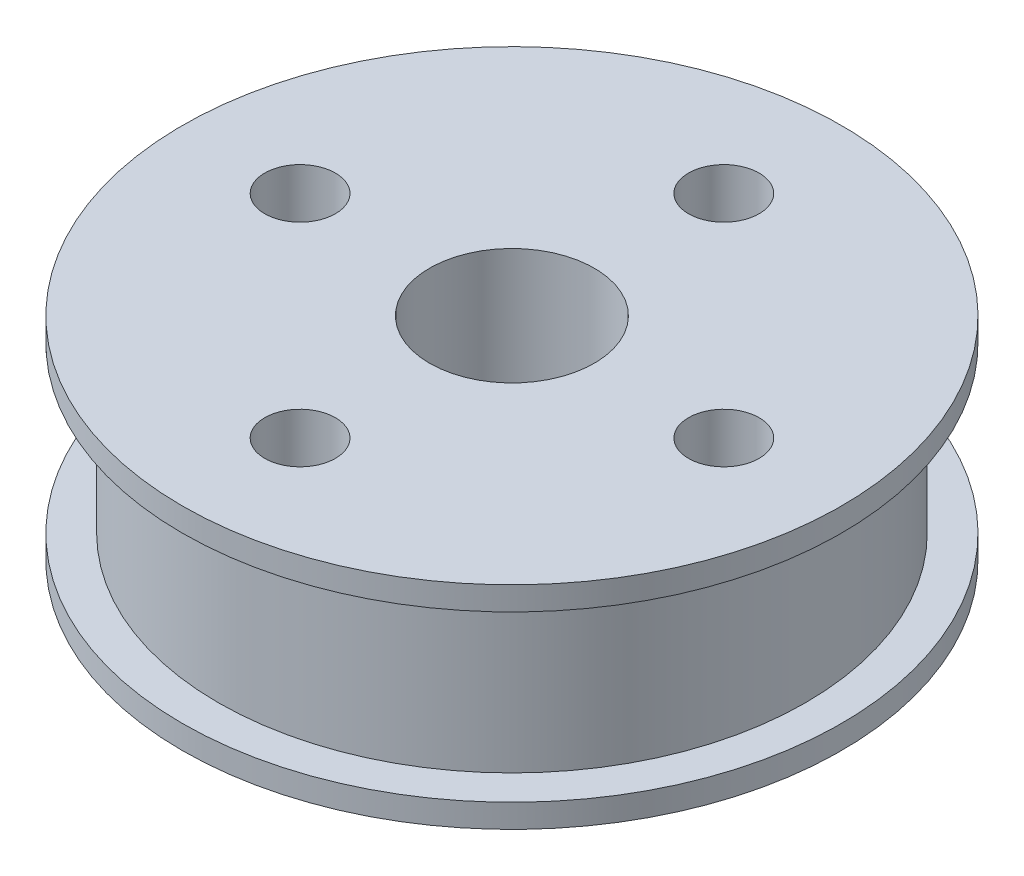
ISO-10303-21;
HEADER;
FILE_DESCRIPTION(('STEP AP214'),'2;1');
FILE_NAME('part.step','',(''),(''),'','','');
FILE_SCHEMA(('AUTOMOTIVE_DESIGN { 1 0 10303 214 1 1 1 1 }'));
ENDSEC;
DATA;
#1=APPLICATION_CONTEXT('core data for automotive mechanical design processes');
#2=APPLICATION_PROTOCOL_DEFINITION('international standard','automotive_design',2000,#1);
#3=PRODUCT_CONTEXT('',#1,'mechanical');
#4=PRODUCT('Part','Part','',(#3));
#5=PRODUCT_RELATED_PRODUCT_CATEGORY('part','',(#4));
#6=PRODUCT_DEFINITION_FORMATION('','',#4);
#7=PRODUCT_DEFINITION_CONTEXT('part definition',#1,'design');
#8=PRODUCT_DEFINITION('design','',#6,#7);
#9=PRODUCT_DEFINITION_SHAPE('','',#8);
#10=(LENGTH_UNIT() NAMED_UNIT(*) SI_UNIT(.MILLI.,.METRE.));
#11=(NAMED_UNIT(*) PLANE_ANGLE_UNIT() SI_UNIT($,.RADIAN.));
#12=(NAMED_UNIT(*) SI_UNIT($,.STERADIAN.) SOLID_ANGLE_UNIT());
#13=UNCERTAINTY_MEASURE_WITH_UNIT(LENGTH_MEASURE(1.E-05),#10,'distance_accuracy_value','');
#14=(GEOMETRIC_REPRESENTATION_CONTEXT(3) GLOBAL_UNCERTAINTY_ASSIGNED_CONTEXT((#13)) GLOBAL_UNIT_ASSIGNED_CONTEXT((#10,
#11,#12)) REPRESENTATION_CONTEXT('',''));
#15=CARTESIAN_POINT('',(0.,0.,0.));
#16=DIRECTION('',(0.,0.,1.));
#17=DIRECTION('',(1.,0.,0.));
#18=AXIS2_PLACEMENT_3D('',#15,#16,#17);
#19=CARTESIAN_POINT('',(0.,1.,0.));
#20=DIRECTION('',(0.,-1.,0.));
#21=DIRECTION('',(0.,0.,-1.));
#22=AXIS2_PLACEMENT_3D('',#19,#20,#21);
#23=CYLINDRICAL_SURFACE('',#22,14.);
#24=CARTESIAN_POINT('',(0.,1.,0.));
#25=DIRECTION('',(0.,1.,0.));
#26=DIRECTION('',(0.,0.,1.));
#27=AXIS2_PLACEMENT_3D('',#24,#25,#26);
#28=CIRCLE('',#27,14.);
#29=CARTESIAN_POINT('',(0.,1.,14.));
#30=VERTEX_POINT('',#29);
#31=EDGE_CURVE('E37',#30,#30,#28,.T.);
#32=ORIENTED_EDGE('',*,*,#31,.F.);
#33=EDGE_LOOP('',(#32));
#34=FACE_BOUND('',#33,.T.);
#35=CARTESIAN_POINT('',(0.,0.,0.));
#36=DIRECTION('',(0.,1.,0.));
#37=DIRECTION('',(0.,0.,1.));
#38=AXIS2_PLACEMENT_3D('',#35,#36,#37);
#39=CIRCLE('',#38,14.);
#40=CARTESIAN_POINT('',(0.,0.,14.));
#41=VERTEX_POINT('',#40);
#42=EDGE_CURVE('E33',#41,#41,#39,.T.);
#43=ORIENTED_EDGE('',*,*,#42,.T.);
#44=EDGE_LOOP('',(#43));
#45=FACE_BOUND('',#44,.T.);
#46=ADVANCED_FACE('F30',(#34,#45),#23,.T.);
#47=CARTESIAN_POINT('',(0.,1.,0.));
#48=DIRECTION('',(0.,1.,0.));
#49=DIRECTION('',(0.,0.,1.));
#50=AXIS2_PLACEMENT_3D('',#47,#48,#49);
#51=PLANE('',#50);
#52=CARTESIAN_POINT('',(0.,1.,0.));
#53=DIRECTION('',(0.,1.,0.));
#54=DIRECTION('',(0.,0.,1.));
#55=AXIS2_PLACEMENT_3D('',#52,#53,#54);
#56=CIRCLE('',#55,12.475);
#57=CARTESIAN_POINT('',(0.,1.,12.475));
#58=VERTEX_POINT('',#57);
#59=EDGE_CURVE('E10',#58,#58,#56,.T.);
#60=ORIENTED_EDGE('',*,*,#59,.F.);
#61=EDGE_LOOP('',(#60));
#62=FACE_BOUND('',#61,.T.);
#63=ORIENTED_EDGE('',*,*,#31,.T.);
#64=EDGE_LOOP('',(#63));
#65=FACE_BOUND('',#64,.T.);
#66=ADVANCED_FACE('F126',(#62,#65),#51,.T.);
#67=CARTESIAN_POINT('',(0.,0.,0.));
#68=DIRECTION('',(0.,1.,0.));
#69=DIRECTION('',(0.,0.,1.));
#70=AXIS2_PLACEMENT_3D('',#67,#68,#69);
#71=PLANE('',#70);
#72=CARTESIAN_POINT('',(9.,0.,0.));
#73=DIRECTION('',(0.,1.,0.));
#74=DIRECTION('',(-1.,0.,0.));
#75=AXIS2_PLACEMENT_3D('',#72,#73,#74);
#76=CIRCLE('',#75,1.5);
#77=CARTESIAN_POINT('',(7.5,0.,0.));
#78=VERTEX_POINT('',#77);
#79=EDGE_CURVE('E62',#78,#78,#76,.T.);
#80=ORIENTED_EDGE('',*,*,#79,.T.);
#81=EDGE_LOOP('',(#80));
#82=FACE_BOUND('',#81,.T.);
#83=CARTESIAN_POINT('',(0.,0.,9.));
#84=DIRECTION('',(0.,1.,0.));
#85=DIRECTION('',(0.,0.,-1.));
#86=AXIS2_PLACEMENT_3D('',#83,#84,#85);
#87=CIRCLE('',#86,1.5);
#88=CARTESIAN_POINT('',(0.,0.,7.5));
#89=VERTEX_POINT('',#88);
#90=EDGE_CURVE('E74',#89,#89,#87,.T.);
#91=ORIENTED_EDGE('',*,*,#90,.T.);
#92=EDGE_LOOP('',(#91));
#93=FACE_BOUND('',#92,.T.);
#94=CARTESIAN_POINT('',(-9.,0.,0.));
#95=DIRECTION('',(0.,1.,0.));
#96=DIRECTION('',(1.,0.,0.));
#97=AXIS2_PLACEMENT_3D('',#94,#95,#96);
#98=CIRCLE('',#97,1.5);
#99=CARTESIAN_POINT('',(-7.5,0.,0.));
#100=VERTEX_POINT('',#99);
#101=EDGE_CURVE('E68',#100,#100,#98,.T.);
#102=ORIENTED_EDGE('',*,*,#101,.T.);
#103=EDGE_LOOP('',(#102));
#104=FACE_BOUND('',#103,.T.);
#105=CARTESIAN_POINT('',(0.,0.,-9.));
#106=DIRECTION('',(0.,1.,0.));
#107=DIRECTION('',(0.,0.,1.));
#108=AXIS2_PLACEMENT_3D('',#105,#106,#107);
#109=CIRCLE('',#108,1.5);
#110=CARTESIAN_POINT('',(0.,0.,-7.5));
#111=VERTEX_POINT('',#110);
#112=EDGE_CURVE('E56',#111,#111,#109,.T.);
#113=ORIENTED_EDGE('',*,*,#112,.T.);
#114=EDGE_LOOP('',(#113));
#115=FACE_BOUND('',#114,.T.);
#116=CARTESIAN_POINT('',(0.,0.,0.));
#117=DIRECTION('',(0.,1.,0.));
#118=DIRECTION('',(0.,0.,1.));
#119=AXIS2_PLACEMENT_3D('',#116,#117,#118);
#120=CIRCLE('',#119,3.5);
#121=CARTESIAN_POINT('',(0.,0.,3.5));
#122=VERTEX_POINT('',#121);
#123=EDGE_CURVE('E50',#122,#122,#120,.T.);
#124=ORIENTED_EDGE('',*,*,#123,.T.);
#125=EDGE_LOOP('',(#124));
#126=FACE_BOUND('',#125,.T.);
#127=ORIENTED_EDGE('',*,*,#42,.F.);
#128=EDGE_LOOP('',(#127));
#129=FACE_BOUND('',#128,.T.);
#130=ADVANCED_FACE('F83',(#82,#93,#104,#115,#126,#129),#71,.F.);
#131=CARTESIAN_POINT('',(0.,8.,0.));
#132=DIRECTION('',(0.,-1.,0.));
#133=DIRECTION('',(0.,0.,-1.));
#134=AXIS2_PLACEMENT_3D('',#131,#132,#133);
#135=CYLINDRICAL_SURFACE('',#134,12.475);
#136=CARTESIAN_POINT('',(0.,8.,0.));
#137=DIRECTION('',(0.,1.,0.));
#138=DIRECTION('',(0.,0.,1.));
#139=AXIS2_PLACEMENT_3D('',#136,#137,#138);
#140=CIRCLE('',#139,12.475);
#141=CARTESIAN_POINT('',(0.,8.,12.475));
#142=VERTEX_POINT('',#141);
#143=EDGE_CURVE('E43',#142,#142,#140,.T.);
#144=ORIENTED_EDGE('',*,*,#143,.F.);
#145=EDGE_LOOP('',(#144));
#146=FACE_BOUND('',#145,.T.);
#147=ORIENTED_EDGE('',*,*,#59,.T.);
#148=EDGE_LOOP('',(#147));
#149=FACE_BOUND('',#148,.T.);
#150=ADVANCED_FACE('F111',(#146,#149),#135,.T.);
#151=CARTESIAN_POINT('',(0.,9.,0.));
#152=DIRECTION('',(0.,-1.,0.));
#153=DIRECTION('',(0.,0.,-1.));
#154=AXIS2_PLACEMENT_3D('',#151,#152,#153);
#155=CYLINDRICAL_SURFACE('',#154,14.);
#156=CARTESIAN_POINT('',(0.,9.,0.));
#157=DIRECTION('',(0.,1.,0.));
#158=DIRECTION('',(0.,0.,1.));
#159=AXIS2_PLACEMENT_3D('',#156,#157,#158);
#160=CIRCLE('',#159,14.);
#161=CARTESIAN_POINT('',(0.,9.,14.));
#162=VERTEX_POINT('',#161);
#163=EDGE_CURVE('E46',#162,#162,#160,.T.);
#164=ORIENTED_EDGE('',*,*,#163,.F.);
#165=EDGE_LOOP('',(#164));
#166=FACE_BOUND('',#165,.T.);
#167=CARTESIAN_POINT('',(0.,8.,0.));
#168=DIRECTION('',(0.,1.,0.));
#169=DIRECTION('',(0.,0.,1.));
#170=AXIS2_PLACEMENT_3D('',#167,#168,#169);
#171=CIRCLE('',#170,14.);
#172=CARTESIAN_POINT('',(0.,8.,14.));
#173=VERTEX_POINT('',#172);
#174=EDGE_CURVE('E47',#173,#173,#171,.T.);
#175=ORIENTED_EDGE('',*,*,#174,.T.);
#176=EDGE_LOOP('',(#175));
#177=FACE_BOUND('',#176,.T.);
#178=ADVANCED_FACE('F97',(#166,#177),#155,.T.);
#179=CARTESIAN_POINT('',(0.,9.,0.));
#180=DIRECTION('',(0.,1.,0.));
#181=DIRECTION('',(0.,0.,1.));
#182=AXIS2_PLACEMENT_3D('',#179,#180,#181);
#183=PLANE('',#182);
#184=CARTESIAN_POINT('',(9.,9.,0.));
#185=DIRECTION('',(0.,1.,0.));
#186=DIRECTION('',(-1.,0.,0.));
#187=AXIS2_PLACEMENT_3D('',#184,#185,#186);
#188=CIRCLE('',#187,1.5);
#189=CARTESIAN_POINT('',(7.5,9.,0.));
#190=VERTEX_POINT('',#189);
#191=EDGE_CURVE('E77',#190,#190,#188,.T.);
#192=ORIENTED_EDGE('',*,*,#191,.F.);
#193=EDGE_LOOP('',(#192));
#194=FACE_BOUND('',#193,.T.);
#195=CARTESIAN_POINT('',(0.,9.,9.));
#196=DIRECTION('',(0.,1.,0.));
#197=DIRECTION('',(0.,0.,-1.));
#198=AXIS2_PLACEMENT_3D('',#195,#196,#197);
#199=CIRCLE('',#198,1.5);
#200=CARTESIAN_POINT('',(0.,9.,7.5));
#201=VERTEX_POINT('',#200);
#202=EDGE_CURVE('E71',#201,#201,#199,.T.);
#203=ORIENTED_EDGE('',*,*,#202,.F.);
#204=EDGE_LOOP('',(#203));
#205=FACE_BOUND('',#204,.T.);
#206=CARTESIAN_POINT('',(-9.,9.,0.));
#207=DIRECTION('',(0.,1.,0.));
#208=DIRECTION('',(1.,0.,0.));
#209=AXIS2_PLACEMENT_3D('',#206,#207,#208);
#210=CIRCLE('',#209,1.5);
#211=CARTESIAN_POINT('',(-7.5,9.,0.));
#212=VERTEX_POINT('',#211);
#213=EDGE_CURVE('E65',#212,#212,#210,.T.);
#214=ORIENTED_EDGE('',*,*,#213,.F.);
#215=EDGE_LOOP('',(#214));
#216=FACE_BOUND('',#215,.T.);
#217=CARTESIAN_POINT('',(0.,9.,-9.));
#218=DIRECTION('',(0.,1.,0.));
#219=DIRECTION('',(0.,0.,1.));
#220=AXIS2_PLACEMENT_3D('',#217,#218,#219);
#221=CIRCLE('',#220,1.5);
#222=CARTESIAN_POINT('',(0.,9.,-7.5));
#223=VERTEX_POINT('',#222);
#224=EDGE_CURVE('E59',#223,#223,#221,.T.);
#225=ORIENTED_EDGE('',*,*,#224,.F.);
#226=EDGE_LOOP('',(#225));
#227=FACE_BOUND('',#226,.T.);
#228=CARTESIAN_POINT('',(0.,9.,0.));
#229=DIRECTION('',(0.,1.,0.));
#230=DIRECTION('',(0.,0.,1.));
#231=AXIS2_PLACEMENT_3D('',#228,#229,#230);
#232=CIRCLE('',#231,3.5);
#233=CARTESIAN_POINT('',(0.,9.,3.5));
#234=VERTEX_POINT('',#233);
#235=EDGE_CURVE('E53',#234,#234,#232,.T.);
#236=ORIENTED_EDGE('',*,*,#235,.F.);
#237=EDGE_LOOP('',(#236));
#238=FACE_BOUND('',#237,.T.);
#239=ORIENTED_EDGE('',*,*,#163,.T.);
#240=EDGE_LOOP('',(#239));
#241=FACE_BOUND('',#240,.T.);
#242=ADVANCED_FACE('F93',(#194,#205,#216,#227,#238,#241),#183,.T.);
#243=CARTESIAN_POINT('',(0.,8.,0.));
#244=DIRECTION('',(0.,1.,0.));
#245=DIRECTION('',(0.,0.,1.));
#246=AXIS2_PLACEMENT_3D('',#243,#244,#245);
#247=PLANE('',#246);
#248=ORIENTED_EDGE('',*,*,#143,.T.);
#249=EDGE_LOOP('',(#248));
#250=FACE_BOUND('',#249,.T.);
#251=ORIENTED_EDGE('',*,*,#174,.F.);
#252=EDGE_LOOP('',(#251));
#253=FACE_BOUND('',#252,.T.);
#254=ADVANCED_FACE('F96',(#250,#253),#247,.F.);
#255=CARTESIAN_POINT('',(0.,0.,0.));
#256=DIRECTION('',(0.,1.,0.));
#257=DIRECTION('',(0.,0.,1.));
#258=AXIS2_PLACEMENT_3D('',#255,#256,#257);
#259=CYLINDRICAL_SURFACE('',#258,3.5);
#260=ORIENTED_EDGE('',*,*,#123,.F.);
#261=EDGE_LOOP('',(#260));
#262=FACE_BOUND('',#261,.T.);
#263=ORIENTED_EDGE('',*,*,#235,.T.);
#264=EDGE_LOOP('',(#263));
#265=FACE_BOUND('',#264,.T.);
#266=ADVANCED_FACE('F116',(#262,#265),#259,.F.);
#267=CARTESIAN_POINT('',(0.,0.,-9.));
#268=DIRECTION('',(0.,1.,0.));
#269=DIRECTION('',(0.,0.,1.));
#270=AXIS2_PLACEMENT_3D('',#267,#268,#269);
#271=CYLINDRICAL_SURFACE('',#270,1.5);
#272=ORIENTED_EDGE('',*,*,#112,.F.);
#273=EDGE_LOOP('',(#272));
#274=FACE_BOUND('',#273,.T.);
#275=ORIENTED_EDGE('',*,*,#224,.T.);
#276=EDGE_LOOP('',(#275));
#277=FACE_BOUND('',#276,.T.);
#278=ADVANCED_FACE('F122',(#274,#277),#271,.F.);
#279=CARTESIAN_POINT('',(-9.,0.,0.));
#280=DIRECTION('',(0.,1.,0.));
#281=DIRECTION('',(0.,0.,1.));
#282=AXIS2_PLACEMENT_3D('',#279,#280,#281);
#283=CYLINDRICAL_SURFACE('',#282,1.5);
#284=ORIENTED_EDGE('',*,*,#101,.F.);
#285=EDGE_LOOP('',(#284));
#286=FACE_BOUND('',#285,.T.);
#287=ORIENTED_EDGE('',*,*,#213,.T.);
#288=EDGE_LOOP('',(#287));
#289=FACE_BOUND('',#288,.T.);
#290=ADVANCED_FACE('F165',(#286,#289),#283,.F.);
#291=CARTESIAN_POINT('',(0.,0.,9.));
#292=DIRECTION('',(0.,1.,0.));
#293=DIRECTION('',(0.,0.,1.));
#294=AXIS2_PLACEMENT_3D('',#291,#292,#293);
#295=CYLINDRICAL_SURFACE('',#294,1.5);
#296=ORIENTED_EDGE('',*,*,#90,.F.);
#297=EDGE_LOOP('',(#296));
#298=FACE_BOUND('',#297,.T.);
#299=ORIENTED_EDGE('',*,*,#202,.T.);
#300=EDGE_LOOP('',(#299));
#301=FACE_BOUND('',#300,.T.);
#302=ADVANCED_FACE('F89',(#298,#301),#295,.F.);
#303=CARTESIAN_POINT('',(9.,0.,0.));
#304=DIRECTION('',(0.,1.,0.));
#305=DIRECTION('',(0.,0.,1.));
#306=AXIS2_PLACEMENT_3D('',#303,#304,#305);
#307=CYLINDRICAL_SURFACE('',#306,1.5);
#308=ORIENTED_EDGE('',*,*,#79,.F.);
#309=EDGE_LOOP('',(#308));
#310=FACE_BOUND('',#309,.T.);
#311=ORIENTED_EDGE('',*,*,#191,.T.);
#312=EDGE_LOOP('',(#311));
#313=FACE_BOUND('',#312,.T.);
#314=ADVANCED_FACE('F86',(#310,#313),#307,.F.);
#315=CLOSED_SHELL('',(#46,#66,#130,#150,#178,#242,#254,#266,#278,#290,#302,#314));
#316=MANIFOLD_SOLID_BREP('B2',#315);
#317=ADVANCED_BREP_SHAPE_REPRESENTATION('',(#18,#316),#14);
#318=SHAPE_DEFINITION_REPRESENTATION(#9,#317);
ENDSEC;
END-ISO-10303-21;
